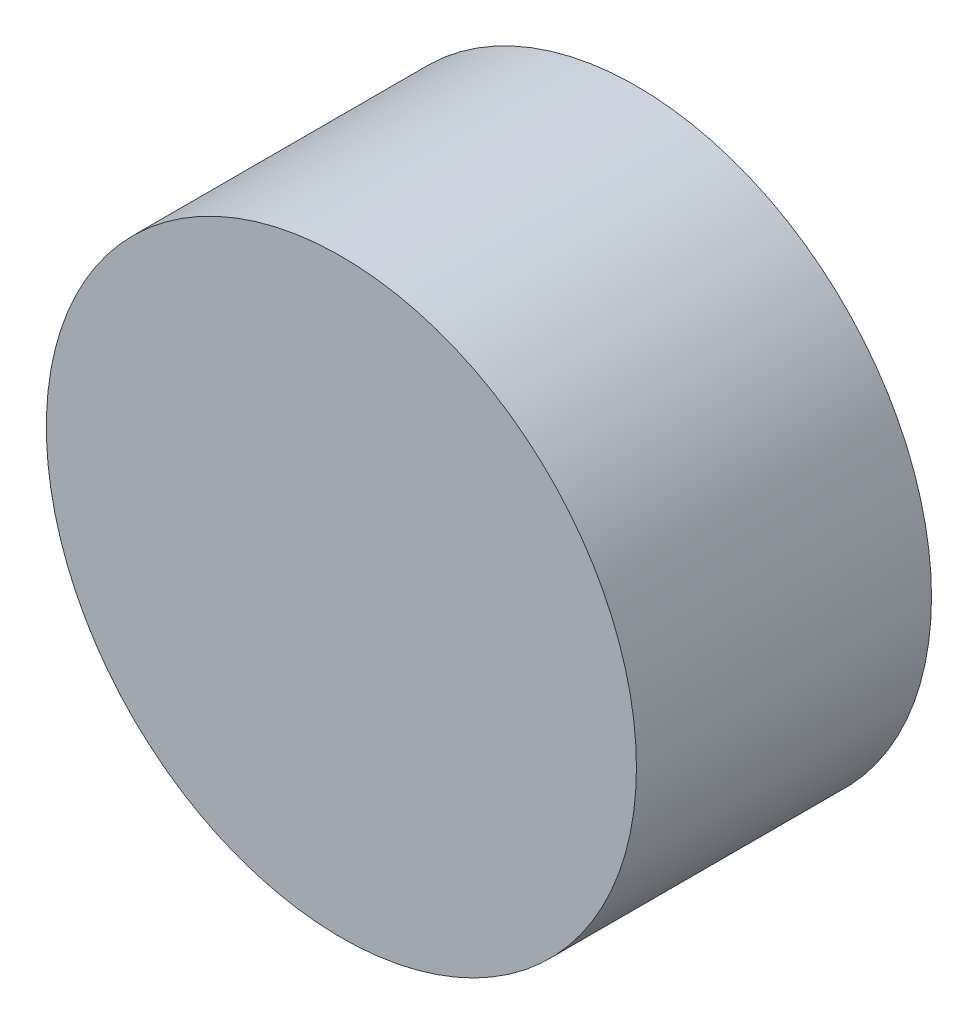
ISO-10303-21;
HEADER;
FILE_DESCRIPTION(('STEP AP214'),'2;1');
FILE_NAME('part.step','',(''),(''),'','','');
FILE_SCHEMA(('AUTOMOTIVE_DESIGN { 1 0 10303 214 1 1 1 1 }'));
ENDSEC;
DATA;
#1=APPLICATION_CONTEXT('core data for automotive mechanical design processes');
#2=APPLICATION_PROTOCOL_DEFINITION('international standard','automotive_design',2000,#1);
#3=PRODUCT_CONTEXT('',#1,'mechanical');
#4=PRODUCT('Part','Part','',(#3));
#5=PRODUCT_RELATED_PRODUCT_CATEGORY('part','',(#4));
#6=PRODUCT_DEFINITION_FORMATION('','',#4);
#7=PRODUCT_DEFINITION_CONTEXT('part definition',#1,'design');
#8=PRODUCT_DEFINITION('design','',#6,#7);
#9=PRODUCT_DEFINITION_SHAPE('','',#8);
#10=(LENGTH_UNIT() NAMED_UNIT(*) SI_UNIT(.MILLI.,.METRE.));
#11=(NAMED_UNIT(*) PLANE_ANGLE_UNIT() SI_UNIT($,.RADIAN.));
#12=(NAMED_UNIT(*) SI_UNIT($,.STERADIAN.) SOLID_ANGLE_UNIT());
#13=UNCERTAINTY_MEASURE_WITH_UNIT(LENGTH_MEASURE(1.E-05),#10,'distance_accuracy_value','');
#14=(GEOMETRIC_REPRESENTATION_CONTEXT(3) GLOBAL_UNCERTAINTY_ASSIGNED_CONTEXT((#13)) GLOBAL_UNIT_ASSIGNED_CONTEXT((#10,
#11,#12)) REPRESENTATION_CONTEXT('',''));
#15=CARTESIAN_POINT('',(0.,0.,0.));
#16=DIRECTION('',(0.,0.,1.));
#17=DIRECTION('',(1.,0.,0.));
#18=AXIS2_PLACEMENT_3D('',#15,#16,#17);
#19=CARTESIAN_POINT('',(0.,0.,8.));
#20=DIRECTION('',(0.,0.,-1.));
#21=DIRECTION('',(-1.,0.,0.));
#22=AXIS2_PLACEMENT_3D('',#19,#20,#21);
#23=CYLINDRICAL_SURFACE('',#22,8.);
#24=CARTESIAN_POINT('',(0.,0.,8.));
#25=DIRECTION('',(0.,0.,1.));
#26=DIRECTION('',(1.,0.,0.));
#27=AXIS2_PLACEMENT_3D('',#24,#25,#26);
#28=CIRCLE('',#27,8.);
#29=CARTESIAN_POINT('',(8.,0.,8.));
#30=VERTEX_POINT('',#29);
#31=EDGE_CURVE('E10',#30,#30,#28,.T.);
#32=ORIENTED_EDGE('',*,*,#31,.F.);
#33=EDGE_LOOP('',(#32));
#34=FACE_BOUND('',#33,.T.);
#35=CARTESIAN_POINT('',(0.,0.,0.));
#36=DIRECTION('',(0.,0.,1.));
#37=DIRECTION('',(1.,0.,0.));
#38=AXIS2_PLACEMENT_3D('',#35,#36,#37);
#39=CIRCLE('',#38,8.);
#40=CARTESIAN_POINT('',(8.,0.,0.));
#41=VERTEX_POINT('',#40);
#42=EDGE_CURVE('E40',#41,#41,#39,.T.);
#43=ORIENTED_EDGE('',*,*,#42,.T.);
#44=EDGE_LOOP('',(#43));
#45=FACE_BOUND('',#44,.T.);
#46=ADVANCED_FACE('F37',(#34,#45),#23,.T.);
#47=CARTESIAN_POINT('',(0.,0.,8.));
#48=DIRECTION('',(0.,0.,1.));
#49=DIRECTION('',(1.,0.,0.));
#50=AXIS2_PLACEMENT_3D('',#47,#48,#49);
#51=PLANE('',#50);
#52=ORIENTED_EDGE('',*,*,#31,.T.);
#53=EDGE_LOOP('',(#52));
#54=FACE_BOUND('',#53,.T.);
#55=ADVANCED_FACE('F52',(#54),#51,.T.);
#56=CARTESIAN_POINT('',(0.,0.,0.));
#57=DIRECTION('',(0.,0.,1.));
#58=DIRECTION('',(1.,0.,0.));
#59=AXIS2_PLACEMENT_3D('',#56,#57,#58);
#60=PLANE('',#59);
#61=ORIENTED_EDGE('',*,*,#42,.F.);
#62=EDGE_LOOP('',(#61));
#63=FACE_BOUND('',#62,.T.);
#64=ADVANCED_FACE('F50',(#63),#60,.F.);
#65=CLOSED_SHELL('',(#46,#55,#64));
#66=MANIFOLD_SOLID_BREP('B2',#65);
#67=ADVANCED_BREP_SHAPE_REPRESENTATION('',(#18,#66),#14);
#68=SHAPE_DEFINITION_REPRESENTATION(#9,#67);
ENDSEC;
END-ISO-10303-21;
